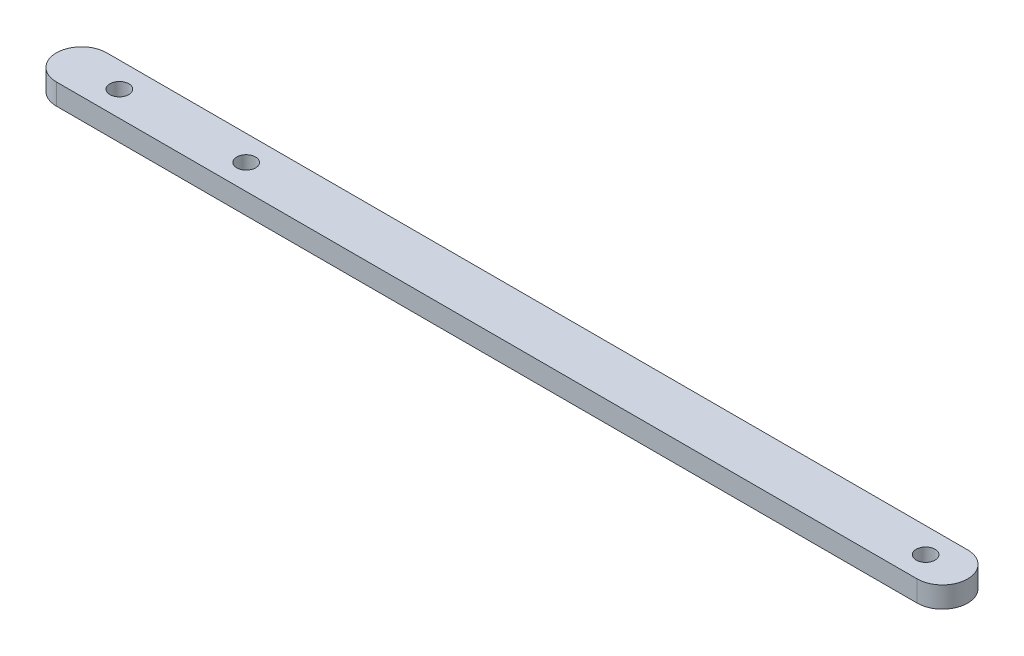
ISO-10303-21;
HEADER;
FILE_DESCRIPTION(('STEP AP214'),'2;1');
FILE_NAME('part.step','',(''),(''),'','','');
FILE_SCHEMA(('AUTOMOTIVE_DESIGN { 1 0 10303 214 1 1 1 1 }'));
ENDSEC;
DATA;
#1=APPLICATION_CONTEXT('core data for automotive mechanical design processes');
#2=APPLICATION_PROTOCOL_DEFINITION('international standard','automotive_design',2000,#1);
#3=PRODUCT_CONTEXT('',#1,'mechanical');
#4=PRODUCT('Part','Part','',(#3));
#5=PRODUCT_RELATED_PRODUCT_CATEGORY('part','',(#4));
#6=PRODUCT_DEFINITION_FORMATION('','',#4);
#7=PRODUCT_DEFINITION_CONTEXT('part definition',#1,'design');
#8=PRODUCT_DEFINITION('design','',#6,#7);
#9=PRODUCT_DEFINITION_SHAPE('','',#8);
#10=(LENGTH_UNIT() NAMED_UNIT(*) SI_UNIT(.MILLI.,.METRE.));
#11=(NAMED_UNIT(*) PLANE_ANGLE_UNIT() SI_UNIT($,.RADIAN.));
#12=(NAMED_UNIT(*) SI_UNIT($,.STERADIAN.) SOLID_ANGLE_UNIT());
#13=UNCERTAINTY_MEASURE_WITH_UNIT(LENGTH_MEASURE(1.E-05),#10,'distance_accuracy_value','');
#14=(GEOMETRIC_REPRESENTATION_CONTEXT(3) GLOBAL_UNCERTAINTY_ASSIGNED_CONTEXT((#13)) GLOBAL_UNIT_ASSIGNED_CONTEXT((#10,
#11,#12)) REPRESENTATION_CONTEXT('',''));
#15=CARTESIAN_POINT('',(0.,0.,0.));
#16=DIRECTION('',(0.,0.,1.));
#17=DIRECTION('',(1.,0.,0.));
#18=AXIS2_PLACEMENT_3D('',#15,#16,#17);
#19=CARTESIAN_POINT('',(-43.6384324904177,5.,0.));
#20=DIRECTION('',(0.,-1.,0.));
#21=DIRECTION('',(0.,0.,-1.));
#22=AXIS2_PLACEMENT_3D('',#19,#20,#21);
#23=CYLINDRICAL_SURFACE('',#22,6.);
#24=CARTESIAN_POINT('',(-43.6384324904177,0.,0.));
#25=DIRECTION('',(0.,1.,0.));
#26=DIRECTION('',(0.,0.,1.));
#27=AXIS2_PLACEMENT_3D('',#24,#25,#26);
#28=CIRCLE('',#27,6.);
#29=CARTESIAN_POINT('',(-43.6384324904177,0.,-6.));
#30=VERTEX_POINT('',#29);
#31=CARTESIAN_POINT('',(-43.6384324904177,0.,6.));
#32=VERTEX_POINT('',#31);
#33=EDGE_CURVE('E110',#30,#32,#28,.T.);
#34=ORIENTED_EDGE('',*,*,#33,.T.);
#35=DIRECTION('',(0.,-1.,0.));
#36=VECTOR('',#35,1.);
#37=CARTESIAN_POINT('',(-43.6384324904177,5.,6.));
#38=LINE('',#37,#36);
#39=CARTESIAN_POINT('',(-43.6384324904177,5.,6.));
#40=VERTEX_POINT('',#39);
#41=EDGE_CURVE('E11',#40,#32,#38,.T.);
#42=ORIENTED_EDGE('',*,*,#41,.F.);
#43=CARTESIAN_POINT('',(-43.6384324904177,5.,0.));
#44=DIRECTION('',(0.,1.,0.));
#45=DIRECTION('',(0.,0.,1.));
#46=AXIS2_PLACEMENT_3D('',#43,#44,#45);
#47=CIRCLE('',#46,6.);
#48=CARTESIAN_POINT('',(-43.6384324904177,5.,-6.));
#49=VERTEX_POINT('',#48);
#50=EDGE_CURVE('E93',#49,#40,#47,.T.);
#51=ORIENTED_EDGE('',*,*,#50,.F.);
#52=DIRECTION('',(0.,-1.,0.));
#53=VECTOR('',#52,1.);
#54=CARTESIAN_POINT('',(-43.6384324904177,5.,-6.));
#55=LINE('',#54,#53);
#56=EDGE_CURVE('E106',#49,#30,#55,.T.);
#57=ORIENTED_EDGE('',*,*,#56,.T.);
#58=EDGE_LOOP('',(#34,#42,#51,#57));
#59=FACE_BOUND('',#58,.T.);
#60=ADVANCED_FACE('F39',(#59),#23,.T.);
#61=CARTESIAN_POINT('',(-43.6384324904177,5.,6.));
#62=DIRECTION('',(0.,0.,-1.));
#63=DIRECTION('',(-1.,0.,0.));
#64=AXIS2_PLACEMENT_3D('',#61,#62,#63);
#65=PLANE('',#64);
#66=DIRECTION('',(1.,0.,0.));
#67=VECTOR('',#66,1.);
#68=CARTESIAN_POINT('',(-43.6384324904177,0.,6.));
#69=LINE('',#68,#67);
#70=CARTESIAN_POINT('',(161.361567509582,0.,6.));
#71=VERTEX_POINT('',#70);
#72=EDGE_CURVE('E98',#32,#71,#69,.T.);
#73=ORIENTED_EDGE('',*,*,#72,.T.);
#74=DIRECTION('',(0.,-1.,0.));
#75=VECTOR('',#74,1.);
#76=CARTESIAN_POINT('',(161.361567509582,5.,6.));
#77=LINE('',#76,#75);
#78=CARTESIAN_POINT('',(161.361567509582,5.,6.));
#79=VERTEX_POINT('',#78);
#80=EDGE_CURVE('E49',#79,#71,#77,.T.);
#81=ORIENTED_EDGE('',*,*,#80,.F.);
#82=DIRECTION('',(1.,0.,0.));
#83=VECTOR('',#82,1.);
#84=CARTESIAN_POINT('',(-43.6384324904177,5.,6.));
#85=LINE('',#84,#83);
#86=EDGE_CURVE('E88',#40,#79,#85,.T.);
#87=ORIENTED_EDGE('',*,*,#86,.F.);
#88=ORIENTED_EDGE('',*,*,#41,.T.);
#89=EDGE_LOOP('',(#73,#81,#87,#88));
#90=FACE_BOUND('',#89,.T.);
#91=ADVANCED_FACE('F97',(#90),#65,.F.);
#92=CARTESIAN_POINT('',(161.361567509582,5.,0.));
#93=DIRECTION('',(0.,-1.,0.));
#94=DIRECTION('',(0.,0.,-1.));
#95=AXIS2_PLACEMENT_3D('',#92,#93,#94);
#96=CYLINDRICAL_SURFACE('',#95,6.);
#97=CARTESIAN_POINT('',(161.361567509582,0.,0.));
#98=DIRECTION('',(0.,1.,0.));
#99=DIRECTION('',(0.,0.,1.));
#100=AXIS2_PLACEMENT_3D('',#97,#98,#99);
#101=CIRCLE('',#100,6.);
#102=CARTESIAN_POINT('',(161.361567509582,0.,-6.));
#103=VERTEX_POINT('',#102);
#104=EDGE_CURVE('E75',#71,#103,#101,.T.);
#105=ORIENTED_EDGE('',*,*,#104,.T.);
#106=DIRECTION('',(0.,-1.,0.));
#107=VECTOR('',#106,1.);
#108=CARTESIAN_POINT('',(161.361567509582,5.,-6.));
#109=LINE('',#108,#107);
#110=CARTESIAN_POINT('',(161.361567509582,5.,-6.));
#111=VERTEX_POINT('',#110);
#112=EDGE_CURVE('E100',#111,#103,#109,.T.);
#113=ORIENTED_EDGE('',*,*,#112,.F.);
#114=CARTESIAN_POINT('',(161.361567509582,5.,0.));
#115=DIRECTION('',(0.,1.,0.));
#116=DIRECTION('',(0.,0.,1.));
#117=AXIS2_PLACEMENT_3D('',#114,#115,#116);
#118=CIRCLE('',#117,6.);
#119=EDGE_CURVE('E91',#79,#111,#118,.T.);
#120=ORIENTED_EDGE('',*,*,#119,.F.);
#121=ORIENTED_EDGE('',*,*,#80,.T.);
#122=EDGE_LOOP('',(#105,#113,#120,#121));
#123=FACE_BOUND('',#122,.T.);
#124=ADVANCED_FACE('F102',(#123),#96,.T.);
#125=CARTESIAN_POINT('',(-43.6384324904177,5.,-6.));
#126=DIRECTION('',(0.,0.,1.));
#127=DIRECTION('',(1.,0.,0.));
#128=AXIS2_PLACEMENT_3D('',#125,#126,#127);
#129=PLANE('',#128);
#130=DIRECTION('',(-1.,0.,0.));
#131=VECTOR('',#130,1.);
#132=CARTESIAN_POINT('',(-43.6384324904177,0.,-6.));
#133=LINE('',#132,#131);
#134=EDGE_CURVE('E81',#103,#30,#133,.T.);
#135=ORIENTED_EDGE('',*,*,#134,.T.);
#136=ORIENTED_EDGE('',*,*,#56,.F.);
#137=DIRECTION('',(-1.,0.,0.));
#138=VECTOR('',#137,1.);
#139=CARTESIAN_POINT('',(-43.6384324904177,5.,-6.));
#140=LINE('',#139,#138);
#141=EDGE_CURVE('E58',#111,#49,#140,.T.);
#142=ORIENTED_EDGE('',*,*,#141,.F.);
#143=ORIENTED_EDGE('',*,*,#112,.T.);
#144=EDGE_LOOP('',(#135,#136,#142,#143));
#145=FACE_BOUND('',#144,.T.);
#146=ADVANCED_FACE('F166',(#145),#129,.F.);
#147=CARTESIAN_POINT('',(-43.6384324904177,5.,0.));
#148=DIRECTION('',(0.,1.,0.));
#149=DIRECTION('',(0.,0.,1.));
#150=AXIS2_PLACEMENT_3D('',#147,#148,#149);
#151=PLANE('',#150);
#152=CARTESIAN_POINT('',(-34.6384324904177,5.,0.));
#153=DIRECTION('',(0.,1.,0.));
#154=DIRECTION('',(0.,0.,1.));
#155=AXIS2_PLACEMENT_3D('',#152,#153,#154);
#156=CIRCLE('',#155,2.25);
#157=CARTESIAN_POINT('',(-34.6384324904177,5.,2.25000000000001));
#158=VERTEX_POINT('',#157);
#159=EDGE_CURVE('E128',#158,#158,#156,.T.);
#160=ORIENTED_EDGE('',*,*,#159,.F.);
#161=EDGE_LOOP('',(#160));
#162=FACE_BOUND('',#161,.T.);
#163=CARTESIAN_POINT('',(-4.43843249041774,5.,0.));
#164=DIRECTION('',(0.,1.,0.));
#165=DIRECTION('',(0.,0.,1.));
#166=AXIS2_PLACEMENT_3D('',#163,#164,#165);
#167=CIRCLE('',#166,2.25);
#168=CARTESIAN_POINT('',(-4.43843249041774,5.,2.25));
#169=VERTEX_POINT('',#168);
#170=EDGE_CURVE('E226',#169,#169,#167,.T.);
#171=ORIENTED_EDGE('',*,*,#170,.F.);
#172=EDGE_LOOP('',(#171));
#173=FACE_BOUND('',#172,.T.);
#174=CARTESIAN_POINT('',(157.361567509582,5.,0.));
#175=DIRECTION('',(0.,1.,0.));
#176=DIRECTION('',(0.,0.,1.));
#177=AXIS2_PLACEMENT_3D('',#174,#175,#176);
#178=CIRCLE('',#177,2.25000000000001);
#179=CARTESIAN_POINT('',(157.361567509582,5.,2.25000000000001));
#180=VERTEX_POINT('',#179);
#181=EDGE_CURVE('E229',#180,#180,#178,.T.);
#182=ORIENTED_EDGE('',*,*,#181,.F.);
#183=EDGE_LOOP('',(#182));
#184=FACE_BOUND('',#183,.T.);
#185=ORIENTED_EDGE('',*,*,#50,.T.);
#186=ORIENTED_EDGE('',*,*,#86,.T.);
#187=ORIENTED_EDGE('',*,*,#119,.T.);
#188=ORIENTED_EDGE('',*,*,#141,.T.);
#189=EDGE_LOOP('',(#185,#186,#187,#188));
#190=FACE_BOUND('',#189,.T.);
#191=ADVANCED_FACE('F89',(#162,#173,#184,#190),#151,.T.);
#192=CARTESIAN_POINT('',(-43.6384324904177,0.,0.));
#193=DIRECTION('',(0.,1.,0.));
#194=DIRECTION('',(0.,0.,1.));
#195=AXIS2_PLACEMENT_3D('',#192,#193,#194);
#196=PLANE('',#195);
#197=CARTESIAN_POINT('',(-34.6384324904177,0.,0.));
#198=DIRECTION('',(0.,1.,0.));
#199=DIRECTION('',(0.,0.,1.));
#200=AXIS2_PLACEMENT_3D('',#197,#198,#199);
#201=CIRCLE('',#200,2.25);
#202=CARTESIAN_POINT('',(-34.6384324904177,0.,2.25000000000001));
#203=VERTEX_POINT('',#202);
#204=EDGE_CURVE('E42',#203,#203,#201,.T.);
#205=ORIENTED_EDGE('',*,*,#204,.T.);
#206=EDGE_LOOP('',(#205));
#207=FACE_BOUND('',#206,.T.);
#208=CARTESIAN_POINT('',(-4.43843249041774,0.,0.));
#209=DIRECTION('',(0.,1.,0.));
#210=DIRECTION('',(0.,0.,1.));
#211=AXIS2_PLACEMENT_3D('',#208,#209,#210);
#212=CIRCLE('',#211,2.25);
#213=CARTESIAN_POINT('',(-4.43843249041774,0.,2.25));
#214=VERTEX_POINT('',#213);
#215=EDGE_CURVE('E127',#214,#214,#212,.T.);
#216=ORIENTED_EDGE('',*,*,#215,.T.);
#217=EDGE_LOOP('',(#216));
#218=FACE_BOUND('',#217,.T.);
#219=CARTESIAN_POINT('',(157.361567509582,0.,0.));
#220=DIRECTION('',(0.,1.,0.));
#221=DIRECTION('',(0.,0.,1.));
#222=AXIS2_PLACEMENT_3D('',#219,#220,#221);
#223=CIRCLE('',#222,2.25000000000001);
#224=CARTESIAN_POINT('',(157.361567509582,0.,2.25000000000001));
#225=VERTEX_POINT('',#224);
#226=EDGE_CURVE('E124',#225,#225,#223,.T.);
#227=ORIENTED_EDGE('',*,*,#226,.T.);
#228=EDGE_LOOP('',(#227));
#229=FACE_BOUND('',#228,.T.);
#230=ORIENTED_EDGE('',*,*,#33,.F.);
#231=ORIENTED_EDGE('',*,*,#134,.F.);
#232=ORIENTED_EDGE('',*,*,#104,.F.);
#233=ORIENTED_EDGE('',*,*,#72,.F.);
#234=EDGE_LOOP('',(#230,#231,#232,#233));
#235=FACE_BOUND('',#234,.T.);
#236=ADVANCED_FACE('F137',(#207,#218,#229,#235),#196,.F.);
#237=CARTESIAN_POINT('',(157.361567509582,-3.,0.));
#238=DIRECTION('',(0.,1.,0.));
#239=DIRECTION('',(0.,0.,1.));
#240=AXIS2_PLACEMENT_3D('',#237,#238,#239);
#241=CYLINDRICAL_SURFACE('',#240,2.25000000000001);
#242=ORIENTED_EDGE('',*,*,#181,.T.);
#243=EDGE_LOOP('',(#242));
#244=FACE_BOUND('',#243,.T.);
#245=ORIENTED_EDGE('',*,*,#226,.F.);
#246=EDGE_LOOP('',(#245));
#247=FACE_BOUND('',#246,.T.);
#248=ADVANCED_FACE('F147',(#244,#247),#241,.F.);
#249=CARTESIAN_POINT('',(-4.43843249041774,-3.,0.));
#250=DIRECTION('',(0.,1.,0.));
#251=DIRECTION('',(0.,0.,1.));
#252=AXIS2_PLACEMENT_3D('',#249,#250,#251);
#253=CYLINDRICAL_SURFACE('',#252,2.25);
#254=ORIENTED_EDGE('',*,*,#170,.T.);
#255=EDGE_LOOP('',(#254));
#256=FACE_BOUND('',#255,.T.);
#257=ORIENTED_EDGE('',*,*,#215,.F.);
#258=EDGE_LOOP('',(#257));
#259=FACE_BOUND('',#258,.T.);
#260=ADVANCED_FACE('F141',(#256,#259),#253,.F.);
#261=CARTESIAN_POINT('',(-34.6384324904177,-3.,0.));
#262=DIRECTION('',(0.,1.,0.));
#263=DIRECTION('',(0.,0.,1.));
#264=AXIS2_PLACEMENT_3D('',#261,#262,#263);
#265=CYLINDRICAL_SURFACE('',#264,2.25);
#266=ORIENTED_EDGE('',*,*,#159,.T.);
#267=EDGE_LOOP('',(#266));
#268=FACE_BOUND('',#267,.T.);
#269=ORIENTED_EDGE('',*,*,#204,.F.);
#270=EDGE_LOOP('',(#269));
#271=FACE_BOUND('',#270,.T.);
#272=ADVANCED_FACE('F139',(#268,#271),#265,.F.);
#273=CLOSED_SHELL('',(#60,#91,#124,#146,#191,#236,#248,#260,#272));
#274=MANIFOLD_SOLID_BREP('B2',#273);
#275=ADVANCED_BREP_SHAPE_REPRESENTATION('',(#18,#274),#14);
#276=SHAPE_DEFINITION_REPRESENTATION(#9,#275);
ENDSEC;
END-ISO-10303-21;
